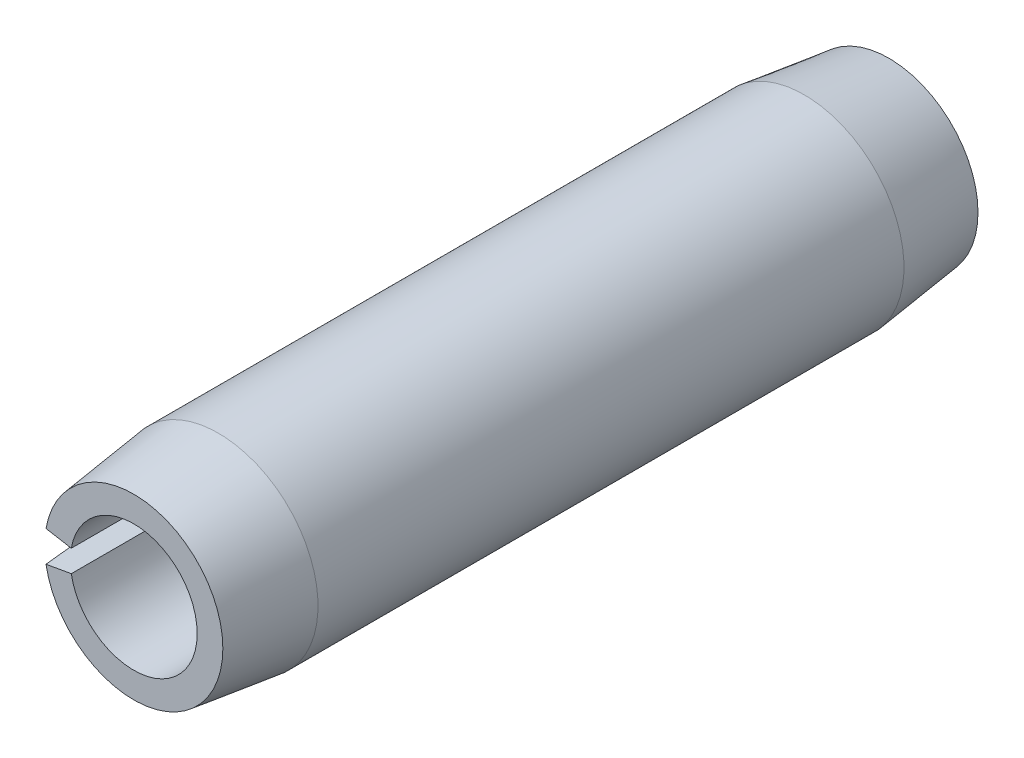
ISO-10303-21;
HEADER;
FILE_DESCRIPTION(('STEP AP214'),'2;1');
FILE_NAME('part.step','',(''),(''),'','','');
FILE_SCHEMA(('AUTOMOTIVE_DESIGN { 1 0 10303 214 1 1 1 1 }'));
ENDSEC;
DATA;
#1=APPLICATION_CONTEXT('core data for automotive mechanical design processes');
#2=APPLICATION_PROTOCOL_DEFINITION('international standard','automotive_design',2000,#1);
#3=PRODUCT_CONTEXT('',#1,'mechanical');
#4=PRODUCT('Part','Part','',(#3));
#5=PRODUCT_RELATED_PRODUCT_CATEGORY('part','',(#4));
#6=PRODUCT_DEFINITION_FORMATION('','',#4);
#7=PRODUCT_DEFINITION_CONTEXT('part definition',#1,'design');
#8=PRODUCT_DEFINITION('design','',#6,#7);
#9=PRODUCT_DEFINITION_SHAPE('','',#8);
#10=(LENGTH_UNIT() NAMED_UNIT(*) SI_UNIT(.MILLI.,.METRE.));
#11=(NAMED_UNIT(*) PLANE_ANGLE_UNIT() SI_UNIT($,.RADIAN.));
#12=(NAMED_UNIT(*) SI_UNIT($,.STERADIAN.) SOLID_ANGLE_UNIT());
#13=UNCERTAINTY_MEASURE_WITH_UNIT(LENGTH_MEASURE(1.E-05),#10,'distance_accuracy_value','');
#14=(GEOMETRIC_REPRESENTATION_CONTEXT(3) GLOBAL_UNCERTAINTY_ASSIGNED_CONTEXT((#13)) GLOBAL_UNIT_ASSIGNED_CONTEXT((#10,
#11,#12)) REPRESENTATION_CONTEXT('',''));
#15=CARTESIAN_POINT('',(0.,0.,0.));
#16=DIRECTION('',(0.,0.,1.));
#17=DIRECTION('',(1.,0.,0.));
#18=AXIS2_PLACEMENT_3D('',#15,#16,#17);
#19=CARTESIAN_POINT('',(0.,0.,-3.175));
#20=DIRECTION('',(0.,0.,1.));
#21=DIRECTION('',(1.,0.,0.));
#22=AXIS2_PLACEMENT_3D('',#19,#20,#21);
#23=PLANE('',#22);
#24=DIRECTION('',(0.984807753012209,-0.173648177666928,0.));
#25=VECTOR('',#24,1.);
#26=CARTESIAN_POINT('',(-0.825465858574833,0.145551902520418,-3.175));
#27=LINE('',#26,#25);
#28=CARTESIAN_POINT('',(-0.737916449332049,0.130114579525829,-3.175));
#29=VERTEX_POINT('',#28);
#30=CARTESIAN_POINT('',(-0.525296455456712,0.0926239379675387,-3.175));
#31=VERTEX_POINT('',#30);
#32=EDGE_CURVE('E110',#29,#31,#27,.T.);
#33=ORIENTED_EDGE('',*,*,#32,.F.);
#34=CARTESIAN_POINT('',(0.,0.,-3.175));
#35=DIRECTION('',(0.,0.,-1.));
#36=DIRECTION('',(-1.,0.,0.));
#37=AXIS2_PLACEMENT_3D('',#34,#35,#36);
#38=CIRCLE('',#37,0.749300000000001);
#39=CARTESIAN_POINT('',(-0.737916449332049,-0.130114579525829,-3.175));
#40=VERTEX_POINT('',#39);
#41=EDGE_CURVE('E128',#29,#40,#38,.T.);
#42=ORIENTED_EDGE('',*,*,#41,.T.);
#43=DIRECTION('',(-0.984807753012209,-0.173648177666928,0.));
#44=VECTOR('',#43,1.);
#45=CARTESIAN_POINT('',(-0.525296455456712,-0.0926239379675387,-3.175));
#46=LINE('',#45,#44);
#47=CARTESIAN_POINT('',(-0.525296455456712,-0.0926239379675387,-3.175));
#48=VERTEX_POINT('',#47);
#49=EDGE_CURVE('E113',#48,#40,#46,.T.);
#50=ORIENTED_EDGE('',*,*,#49,.F.);
#51=CARTESIAN_POINT('',(0.,0.,-3.175));
#52=DIRECTION('',(0.,0.,-1.));
#53=DIRECTION('',(1.,0.,0.));
#54=AXIS2_PLACEMENT_3D('',#51,#52,#53);
#55=CIRCLE('',#54,0.5334);
#56=EDGE_CURVE('E116',#31,#48,#55,.T.);
#57=ORIENTED_EDGE('',*,*,#56,.F.);
#58=EDGE_LOOP('',(#33,#42,#50,#57));
#59=FACE_BOUND('',#58,.T.);
#60=ADVANCED_FACE('F32',(#59),#23,.F.);
#61=CARTESIAN_POINT('',(0.,0.,3.175));
#62=DIRECTION('',(0.,0.,-1.));
#63=DIRECTION('',(-1.,0.,0.));
#64=AXIS2_PLACEMENT_3D('',#61,#62,#63);
#65=CYLINDRICAL_SURFACE('',#64,0.5334);
#66=ORIENTED_EDGE('',*,*,#56,.T.);
#67=DIRECTION('',(0.,0.,-1.));
#68=VECTOR('',#67,1.);
#69=CARTESIAN_POINT('',(-0.525296455456712,-0.0926239379675387,3.175));
#70=LINE('',#69,#68);
#71=CARTESIAN_POINT('',(-0.525296455456712,-0.0926239379675387,3.175));
#72=VERTEX_POINT('',#71);
#73=EDGE_CURVE('E11',#72,#48,#70,.T.);
#74=ORIENTED_EDGE('',*,*,#73,.F.);
#75=CARTESIAN_POINT('',(0.,0.,3.175));
#76=DIRECTION('',(0.,0.,-1.));
#77=DIRECTION('',(1.,0.,0.));
#78=AXIS2_PLACEMENT_3D('',#75,#76,#77);
#79=CIRCLE('',#78,0.5334);
#80=CARTESIAN_POINT('',(-0.525296455456712,0.0926239379675387,3.175));
#81=VERTEX_POINT('',#80);
#82=EDGE_CURVE('E112',#81,#72,#79,.T.);
#83=ORIENTED_EDGE('',*,*,#82,.F.);
#84=DIRECTION('',(0.,0.,-1.));
#85=VECTOR('',#84,1.);
#86=CARTESIAN_POINT('',(-0.525296455456712,0.0926239379675387,3.175));
#87=LINE('',#86,#85);
#88=EDGE_CURVE('E105',#81,#31,#87,.T.);
#89=ORIENTED_EDGE('',*,*,#88,.T.);
#90=EDGE_LOOP('',(#66,#74,#83,#89));
#91=FACE_BOUND('',#90,.T.);
#92=ADVANCED_FACE('F34',(#91),#65,.F.);
#93=CARTESIAN_POINT('',(-0.525296455456712,-0.0926239379675387,3.175));
#94=DIRECTION('',(0.173648177666928,-0.984807753012209,0.));
#95=DIRECTION('',(0.984807753012209,0.173648177666928,0.));
#96=AXIS2_PLACEMENT_3D('',#93,#94,#95);
#97=PLANE('',#96);
#98=DIRECTION('',(0.,0.,-1.));
#99=VECTOR('',#98,1.);
#100=CARTESIAN_POINT('',(-0.825465858574833,-0.145551902520418,3.175));
#101=LINE('',#100,#99);
#102=CARTESIAN_POINT('',(-0.825465858574835,-0.145551902520418,2.4638));
#103=VERTEX_POINT('',#102);
#104=CARTESIAN_POINT('',(-0.825465858574835,-0.145551902520418,-2.4638));
#105=VERTEX_POINT('',#104);
#106=EDGE_CURVE('E40',#103,#105,#101,.T.);
#107=ORIENTED_EDGE('',*,*,#106,.F.);
#108=DIRECTION('',(-0.122150368266264,-0.0215384056288171,-0.992277876713668));
#109=VECTOR('',#108,1.);
#110=CARTESIAN_POINT('',(0.,0.,9.16940000000001));
#111=LINE('',#110,#109);
#112=CARTESIAN_POINT('',(-0.737916449332049,-0.130114579525829,3.175));
#113=VERTEX_POINT('',#112);
#114=EDGE_CURVE('E87',#103,#113,#111,.F.);
#115=ORIENTED_EDGE('',*,*,#114,.T.);
#116=DIRECTION('',(-0.984807753012209,-0.173648177666928,0.));
#117=VECTOR('',#116,1.);
#118=CARTESIAN_POINT('',(-0.525296455456712,-0.0926239379675387,3.175));
#119=LINE('',#118,#117);
#120=EDGE_CURVE('E120',#72,#113,#119,.T.);
#121=ORIENTED_EDGE('',*,*,#120,.F.);
#122=ORIENTED_EDGE('',*,*,#73,.T.);
#123=ORIENTED_EDGE('',*,*,#49,.T.);
#124=DIRECTION('',(0.122150368266264,0.0215384056288171,-0.992277876713668));
#125=VECTOR('',#124,1.);
#126=CARTESIAN_POINT('',(0.,0.,-9.1694));
#127=LINE('',#126,#125);
#128=EDGE_CURVE('E55',#40,#105,#127,.F.);
#129=ORIENTED_EDGE('',*,*,#128,.T.);
#130=EDGE_LOOP('',(#107,#115,#121,#122,#123,#129));
#131=FACE_BOUND('',#130,.T.);
#132=ADVANCED_FACE('F134',(#131),#97,.F.);
#133=CARTESIAN_POINT('',(0.,0.,3.175));
#134=DIRECTION('',(0.,0.,-1.));
#135=DIRECTION('',(-1.,0.,0.));
#136=AXIS2_PLACEMENT_3D('',#133,#134,#135);
#137=CYLINDRICAL_SURFACE('',#136,0.8382);
#138=DIRECTION('',(0.,0.,-1.));
#139=VECTOR('',#138,1.);
#140=CARTESIAN_POINT('',(-0.825465858574833,0.145551902520418,3.175));
#141=LINE('',#140,#139);
#142=CARTESIAN_POINT('',(-0.825465858574834,0.145551902520418,2.4638));
#143=VERTEX_POINT('',#142);
#144=CARTESIAN_POINT('',(-0.825465858574834,0.145551902520418,-2.4638));
#145=VERTEX_POINT('',#144);
#146=EDGE_CURVE('E97',#143,#145,#141,.T.);
#147=ORIENTED_EDGE('',*,*,#146,.F.);
#148=CARTESIAN_POINT('',(0.,0.,2.4638));
#149=DIRECTION('',(0.,0.,-1.));
#150=DIRECTION('',(-1.,0.,0.));
#151=AXIS2_PLACEMENT_3D('',#148,#149,#150);
#152=CIRCLE('',#151,0.838200000000001);
#153=EDGE_CURVE('E84',#143,#103,#152,.T.);
#154=ORIENTED_EDGE('',*,*,#153,.T.);
#155=ORIENTED_EDGE('',*,*,#106,.T.);
#156=CARTESIAN_POINT('',(0.,0.,-2.4638));
#157=DIRECTION('',(0.,0.,-1.));
#158=DIRECTION('',(-1.,0.,0.));
#159=AXIS2_PLACEMENT_3D('',#156,#157,#158);
#160=CIRCLE('',#159,0.838200000000001);
#161=EDGE_CURVE('E104',#145,#105,#160,.T.);
#162=ORIENTED_EDGE('',*,*,#161,.F.);
#163=EDGE_LOOP('',(#147,#154,#155,#162));
#164=FACE_BOUND('',#163,.T.);
#165=ADVANCED_FACE('F103',(#164),#137,.T.);
#166=CARTESIAN_POINT('',(-0.825465858574833,0.145551902520418,3.175));
#167=DIRECTION('',(0.173648177666928,0.984807753012209,0.));
#168=DIRECTION('',(-0.984807753012209,0.173648177666928,0.));
#169=AXIS2_PLACEMENT_3D('',#166,#167,#168);
#170=PLANE('',#169);
#171=DIRECTION('',(0.984807753012209,-0.173648177666928,0.));
#172=VECTOR('',#171,1.);
#173=CARTESIAN_POINT('',(-0.825465858574833,0.145551902520418,3.175));
#174=LINE('',#173,#172);
#175=CARTESIAN_POINT('',(-0.737916449332049,0.130114579525829,3.175));
#176=VERTEX_POINT('',#175);
#177=EDGE_CURVE('E100',#176,#81,#174,.T.);
#178=ORIENTED_EDGE('',*,*,#177,.F.);
#179=DIRECTION('',(0.122150368266264,-0.0215384056288171,0.992277876713668));
#180=VECTOR('',#179,1.);
#181=CARTESIAN_POINT('',(0.,0.,9.16940000000001));
#182=LINE('',#181,#180);
#183=EDGE_CURVE('E47',#176,#143,#182,.F.);
#184=ORIENTED_EDGE('',*,*,#183,.T.);
#185=ORIENTED_EDGE('',*,*,#146,.T.);
#186=DIRECTION('',(-0.122150368266264,0.0215384056288171,0.992277876713668));
#187=VECTOR('',#186,1.);
#188=CARTESIAN_POINT('',(0.,0.,-9.1694));
#189=LINE('',#188,#187);
#190=EDGE_CURVE('E126',#145,#29,#189,.F.);
#191=ORIENTED_EDGE('',*,*,#190,.T.);
#192=ORIENTED_EDGE('',*,*,#32,.T.);
#193=ORIENTED_EDGE('',*,*,#88,.F.);
#194=EDGE_LOOP('',(#178,#184,#185,#191,#192,#193));
#195=FACE_BOUND('',#194,.T.);
#196=ADVANCED_FACE('F95',(#195),#170,.F.);
#197=CARTESIAN_POINT('',(0.,0.,3.175));
#198=DIRECTION('',(0.,0.,1.));
#199=DIRECTION('',(1.,0.,0.));
#200=AXIS2_PLACEMENT_3D('',#197,#198,#199);
#201=PLANE('',#200);
#202=CARTESIAN_POINT('',(0.,0.,3.175));
#203=DIRECTION('',(0.,0.,-1.));
#204=DIRECTION('',(-1.,0.,0.));
#205=AXIS2_PLACEMENT_3D('',#202,#203,#204);
#206=CIRCLE('',#205,0.749300000000001);
#207=EDGE_CURVE('E91',#176,#113,#206,.T.);
#208=ORIENTED_EDGE('',*,*,#207,.F.);
#209=ORIENTED_EDGE('',*,*,#177,.T.);
#210=ORIENTED_EDGE('',*,*,#82,.T.);
#211=ORIENTED_EDGE('',*,*,#120,.T.);
#212=EDGE_LOOP('',(#208,#209,#210,#211));
#213=FACE_BOUND('',#212,.T.);
#214=ADVANCED_FACE('F135',(#213),#201,.T.);
#215=CARTESIAN_POINT('',(0.,0.,-2.4638));
#216=DIRECTION('',(0.,0.,1.));
#217=DIRECTION('',(1.,0.,0.));
#218=AXIS2_PLACEMENT_3D('',#215,#216,#217);
#219=CONICAL_SURFACE('',#218,0.838200000000001,0.124354994546762);
#220=ORIENTED_EDGE('',*,*,#41,.F.);
#221=ORIENTED_EDGE('',*,*,#190,.F.);
#222=ORIENTED_EDGE('',*,*,#161,.T.);
#223=ORIENTED_EDGE('',*,*,#128,.F.);
#224=EDGE_LOOP('',(#220,#221,#222,#223));
#225=FACE_BOUND('',#224,.T.);
#226=ADVANCED_FACE('F142',(#225),#219,.T.);
#227=CARTESIAN_POINT('',(0.,0.,3.175));
#228=DIRECTION('',(0.,0.,-1.));
#229=DIRECTION('',(-1.,0.,0.));
#230=AXIS2_PLACEMENT_3D('',#227,#228,#229);
#231=CONICAL_SURFACE('',#230,0.749300000000001,0.124354994546761);
#232=ORIENTED_EDGE('',*,*,#153,.F.);
#233=ORIENTED_EDGE('',*,*,#183,.F.);
#234=ORIENTED_EDGE('',*,*,#207,.T.);
#235=ORIENTED_EDGE('',*,*,#114,.F.);
#236=EDGE_LOOP('',(#232,#233,#234,#235));
#237=FACE_BOUND('',#236,.T.);
#238=ADVANCED_FACE('F85',(#237),#231,.T.);
#239=CLOSED_SHELL('',(#60,#92,#132,#165,#196,#214,#226,#238));
#240=MANIFOLD_SOLID_BREP('B2',#239);
#241=ADVANCED_BREP_SHAPE_REPRESENTATION('',(#18,#240),#14);
#242=SHAPE_DEFINITION_REPRESENTATION(#9,#241);
ENDSEC;
END-ISO-10303-21;
